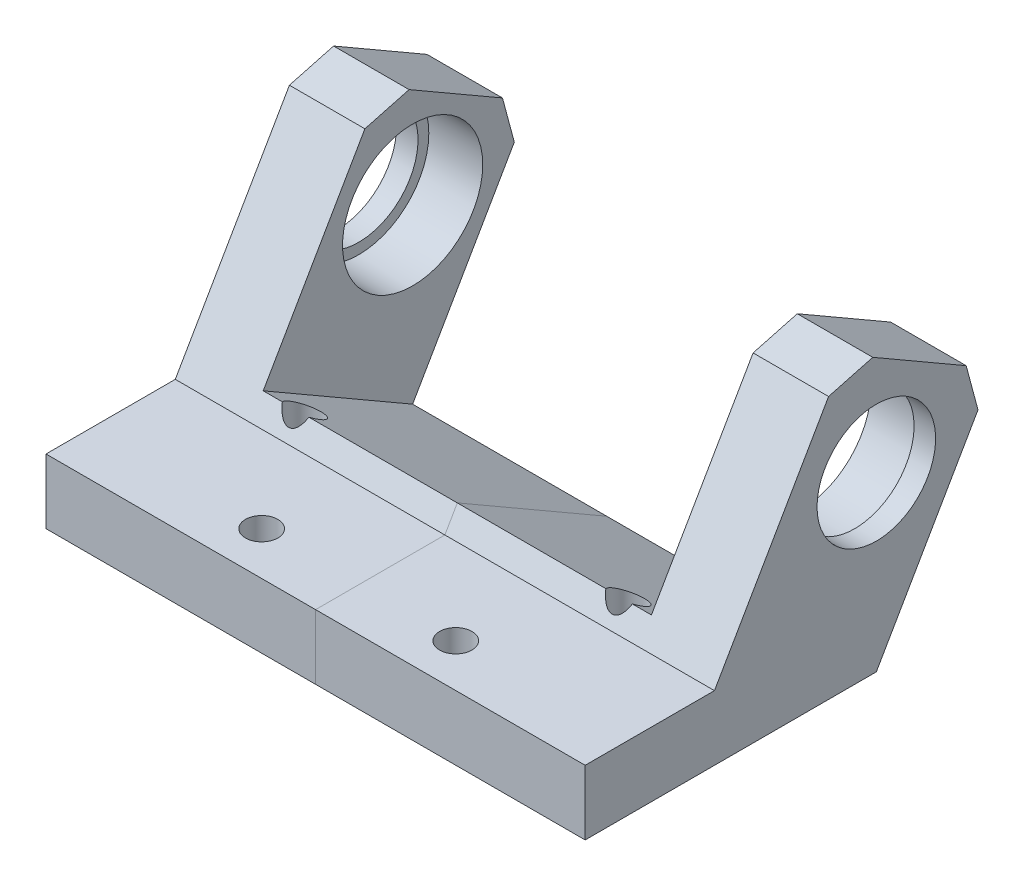
ISO-10303-21;
HEADER;
FILE_DESCRIPTION(('STEP AP214'),'2;1');
FILE_NAME('part.step','',(''),(''),'','','');
FILE_SCHEMA(('AUTOMOTIVE_DESIGN { 1 0 10303 214 1 1 1 1 }'));
ENDSEC;
DATA;
#1=APPLICATION_CONTEXT('core data for automotive mechanical design processes');
#2=APPLICATION_PROTOCOL_DEFINITION('international standard','automotive_design',2000,#1);
#3=PRODUCT_CONTEXT('',#1,'mechanical');
#4=PRODUCT('Part','Part','',(#3));
#5=PRODUCT_RELATED_PRODUCT_CATEGORY('part','',(#4));
#6=PRODUCT_DEFINITION_FORMATION('','',#4);
#7=PRODUCT_DEFINITION_CONTEXT('part definition',#1,'design');
#8=PRODUCT_DEFINITION('design','',#6,#7);
#9=PRODUCT_DEFINITION_SHAPE('','',#8);
#10=(LENGTH_UNIT() NAMED_UNIT(*) SI_UNIT(.MILLI.,.METRE.));
#11=(NAMED_UNIT(*) PLANE_ANGLE_UNIT() SI_UNIT($,.RADIAN.));
#12=(NAMED_UNIT(*) SI_UNIT($,.STERADIAN.) SOLID_ANGLE_UNIT());
#13=UNCERTAINTY_MEASURE_WITH_UNIT(LENGTH_MEASURE(1.E-05),#10,'distance_accuracy_value','');
#14=(GEOMETRIC_REPRESENTATION_CONTEXT(3) GLOBAL_UNCERTAINTY_ASSIGNED_CONTEXT((#13)) GLOBAL_UNIT_ASSIGNED_CONTEXT((#10,
#11,#12)) REPRESENTATION_CONTEXT('',''));
#15=CARTESIAN_POINT('',(0.,0.,0.));
#16=DIRECTION('',(0.,0.,1.));
#17=DIRECTION('',(1.,0.,0.));
#18=AXIS2_PLACEMENT_3D('',#15,#16,#17);
#19=CARTESIAN_POINT('',(0.,0.,0.));
#20=DIRECTION('',(1.,0.,0.));
#21=DIRECTION('',(0.,0.,1.));
#22=AXIS2_PLACEMENT_3D('',#19,#20,#21);
#23=PLANE('',#22);
#24=DIRECTION('',(0.,0.499999999999999,0.866025403784439));
#25=VECTOR('',#24,1.);
#26=CARTESIAN_POINT('',(0.,0.,0.));
#27=LINE('',#26,#25);
#28=CARTESIAN_POINT('',(0.,0.,0.));
#29=VERTEX_POINT('',#28);
#30=CARTESIAN_POINT('',(0.,7.99999999999997,13.856406460551));
#31=VERTEX_POINT('',#30);
#32=EDGE_CURVE('E152',#29,#31,#27,.T.);
#33=ORIENTED_EDGE('',*,*,#32,.T.);
#34=DIRECTION('',(0.,0.86602540378444,-0.499999999999998));
#35=VECTOR('',#34,1.);
#36=CARTESIAN_POINT('',(0.,26.9282032302755,2.92820323027557));
#37=LINE('',#36,#35);
#38=CARTESIAN_POINT('',(0.,6.,15.0111069989303));
#39=VERTEX_POINT('',#38);
#40=EDGE_CURVE('E132',#39,#31,#37,.T.);
#41=ORIENTED_EDGE('',*,*,#40,.F.);
#42=DIRECTION('',(0.,0.,-1.));
#43=VECTOR('',#42,1.);
#44=CARTESIAN_POINT('',(0.,6.,15.0111069989303));
#45=LINE('',#44,#43);
#46=CARTESIAN_POINT('',(0.,6.,27.));
#47=VERTEX_POINT('',#46);
#48=EDGE_CURVE('E142',#47,#39,#45,.T.);
#49=ORIENTED_EDGE('',*,*,#48,.F.);
#50=DIRECTION('',(0.,1.,0.));
#51=VECTOR('',#50,1.);
#52=CARTESIAN_POINT('',(0.,6.,27.));
#53=LINE('',#52,#51);
#54=CARTESIAN_POINT('',(0.,0.,27.));
#55=VERTEX_POINT('',#54);
#56=EDGE_CURVE('E148',#55,#47,#53,.T.);
#57=ORIENTED_EDGE('',*,*,#56,.F.);
#58=DIRECTION('',(0.,0.,1.));
#59=VECTOR('',#58,1.);
#60=CARTESIAN_POINT('',(0.,0.,27.));
#61=LINE('',#60,#59);
#62=EDGE_CURVE('E214',#29,#55,#61,.T.);
#63=ORIENTED_EDGE('',*,*,#62,.F.);
#64=EDGE_LOOP('',(#33,#41,#49,#57,#63));
#65=FACE_BOUND('',#64,.T.);
#66=ADVANCED_FACE('F49',(#65),#23,.T.);
#67=CARTESIAN_POINT('',(-23.,16.,0.));
#68=DIRECTION('',(-1.,0.,0.));
#69=DIRECTION('',(0.,0.,1.));
#70=AXIS2_PLACEMENT_3D('',#67,#68,#69);
#71=PLANE('',#70);
#72=CARTESIAN_POINT('',(-23.,16.,0.));
#73=DIRECTION('',(-1.,0.,0.));
#74=DIRECTION('',(0.,0.,1.));
#75=AXIS2_PLACEMENT_3D('',#72,#73,#74);
#76=CIRCLE('',#75,6.5);
#77=CARTESIAN_POINT('',(-23.,16.,6.50000000000004));
#78=VERTEX_POINT('',#77);
#79=EDGE_CURVE('E195',#78,#78,#76,.T.);
#80=ORIENTED_EDGE('',*,*,#79,.F.);
#81=EDGE_LOOP('',(#80));
#82=FACE_BOUND('',#81,.T.);
#83=CARTESIAN_POINT('',(-23.,16.,0.));
#84=DIRECTION('',(-1.,0.,0.));
#85=DIRECTION('',(0.,0.,1.));
#86=AXIS2_PLACEMENT_3D('',#83,#84,#85);
#87=CIRCLE('',#86,5.5);
#88=CARTESIAN_POINT('',(-23.,16.,5.50000000000004));
#89=VERTEX_POINT('',#88);
#90=EDGE_CURVE('E199',#89,#89,#87,.T.);
#91=ORIENTED_EDGE('',*,*,#90,.T.);
#92=EDGE_LOOP('',(#91));
#93=FACE_BOUND('',#92,.T.);
#94=ADVANCED_FACE('F274',(#82,#93),#71,.F.);
#95=CARTESIAN_POINT('',(-23.,16.,0.));
#96=DIRECTION('',(-1.,0.,0.));
#97=DIRECTION('',(0.,0.,-1.));
#98=AXIS2_PLACEMENT_3D('',#95,#96,#97);
#99=CYLINDRICAL_SURFACE('',#98,5.5);
#100=ORIENTED_EDGE('',*,*,#90,.F.);
#101=EDGE_LOOP('',(#100));
#102=FACE_BOUND('',#101,.T.);
#103=CARTESIAN_POINT('',(-25.,16.,0.));
#104=DIRECTION('',(-1.,0.,0.));
#105=DIRECTION('',(0.,0.,1.));
#106=AXIS2_PLACEMENT_3D('',#103,#104,#105);
#107=CIRCLE('',#106,5.5);
#108=CARTESIAN_POINT('',(-25.,16.,5.50000000000004));
#109=VERTEX_POINT('',#108);
#110=EDGE_CURVE('E200',#109,#109,#107,.T.);
#111=ORIENTED_EDGE('',*,*,#110,.T.);
#112=EDGE_LOOP('',(#111));
#113=FACE_BOUND('',#112,.T.);
#114=ADVANCED_FACE('F272',(#102,#113),#99,.F.);
#115=CARTESIAN_POINT('',(25.,18.9282032302755,-10.9282032302755));
#116=DIRECTION('',(0.,-0.86602540378444,0.499999999999998));
#117=DIRECTION('',(0.,0.499999999999998,0.86602540378444));
#118=AXIS2_PLACEMENT_3D('',#115,#116,#117);
#119=PLANE('',#118);
#120=DIRECTION('',(1.,0.,0.));
#121=VECTOR('',#120,1.);
#122=CARTESIAN_POINT('',(25.,20.4282032302755,-8.33012701892215));
#123=LINE('',#122,#121);
#124=CARTESIAN_POINT('',(-25.,20.4282032302755,-8.33012701892215));
#125=VERTEX_POINT('',#124);
#126=CARTESIAN_POINT('',(-18.,20.4282032302755,-8.33012701892215));
#127=VERTEX_POINT('',#126);
#128=EDGE_CURVE('E159',#125,#127,#123,.T.);
#129=ORIENTED_EDGE('',*,*,#128,.F.);
#130=DIRECTION('',(0.,-0.499999999999998,-0.86602540378444));
#131=VECTOR('',#130,1.);
#132=CARTESIAN_POINT('',(-25.,18.9282032302755,-10.9282032302755));
#133=LINE('',#132,#131);
#134=CARTESIAN_POINT('',(-25.,25.4282032302755,0.33012701892226));
#135=VERTEX_POINT('',#134);
#136=EDGE_CURVE('E231',#135,#125,#133,.T.);
#137=ORIENTED_EDGE('',*,*,#136,.F.);
#138=DIRECTION('',(-1.,0.,0.));
#139=VECTOR('',#138,1.);
#140=CARTESIAN_POINT('',(25.,25.4282032302755,0.330127018922264));
#141=LINE('',#140,#139);
#142=CARTESIAN_POINT('',(-18.,25.4282032302755,0.330127018922256));
#143=VERTEX_POINT('',#142);
#144=EDGE_CURVE('E163',#143,#135,#141,.T.);
#145=ORIENTED_EDGE('',*,*,#144,.F.);
#146=DIRECTION('',(0.,-0.499999999999999,-0.866025403784439));
#147=VECTOR('',#146,1.);
#148=CARTESIAN_POINT('',(-18.,26.9282032302755,2.92820323027556));
#149=LINE('',#148,#147);
#150=EDGE_CURVE('E193',#143,#127,#149,.T.);
#151=ORIENTED_EDGE('',*,*,#150,.T.);
#152=EDGE_LOOP('',(#129,#137,#145,#151));
#153=FACE_BOUND('',#152,.T.);
#154=ADVANCED_FACE('F257',(#153),#119,.F.);
#155=CARTESIAN_POINT('',(25.,16.3301270189222,-9.42820323027548));
#156=DIRECTION('',(0.,-0.258819045102525,0.965925826289067));
#157=DIRECTION('',(-1.,0.,0.));
#158=AXIS2_PLACEMENT_3D('',#155,#156,#157);
#159=PLANE('',#158);
#160=DIRECTION('',(0.,0.965925826289067,0.258819045102525));
#161=VECTOR('',#160,1.);
#162=CARTESIAN_POINT('',(-18.,16.3301270189222,-9.42820323027548));
#163=LINE('',#162,#161);
#164=CARTESIAN_POINT('',(-18.,16.3301270189222,-9.42820323027548));
#165=VERTEX_POINT('',#164);
#166=EDGE_CURVE('E188',#127,#165,#163,.F.);
#167=ORIENTED_EDGE('',*,*,#166,.T.);
#168=DIRECTION('',(-1.,0.,0.));
#169=VECTOR('',#168,1.);
#170=CARTESIAN_POINT('',(25.,16.3301270189222,-9.42820323027548));
#171=LINE('',#170,#169);
#172=CARTESIAN_POINT('',(-25.,16.3301270189222,-9.42820323027548));
#173=VERTEX_POINT('',#172);
#174=EDGE_CURVE('E167',#165,#173,#171,.T.);
#175=ORIENTED_EDGE('',*,*,#174,.T.);
#176=DIRECTION('',(0.,-0.965925826289067,-0.258819045102525));
#177=VECTOR('',#176,1.);
#178=CARTESIAN_POINT('',(-25.,16.3301270189222,-9.42820323027548));
#179=LINE('',#178,#177);
#180=EDGE_CURVE('E166',#173,#125,#179,.F.);
#181=ORIENTED_EDGE('',*,*,#180,.T.);
#182=ORIENTED_EDGE('',*,*,#128,.T.);
#183=EDGE_LOOP('',(#167,#175,#181,#182));
#184=FACE_BOUND('',#183,.T.);
#185=ADVANCED_FACE('F247',(#184),#159,.F.);
#186=CARTESIAN_POINT('',(25.,16.,0.));
#187=DIRECTION('',(-1.,0.,0.));
#188=DIRECTION('',(0.,0.,-1.));
#189=AXIS2_PLACEMENT_3D('',#186,#187,#188);
#190=CYLINDRICAL_SURFACE('',#189,6.5);
#191=CARTESIAN_POINT('',(-18.,16.,0.));
#192=DIRECTION('',(1.,0.,0.));
#193=DIRECTION('',(0.,0.,-1.));
#194=AXIS2_PLACEMENT_3D('',#191,#192,#193);
#195=CIRCLE('',#194,6.5);
#196=CARTESIAN_POINT('',(-18.,16.,-6.49999999999997));
#197=VERTEX_POINT('',#196);
#198=EDGE_CURVE('E241',#197,#197,#195,.T.);
#199=ORIENTED_EDGE('',*,*,#198,.T.);
#200=EDGE_LOOP('',(#199));
#201=FACE_BOUND('',#200,.T.);
#202=ORIENTED_EDGE('',*,*,#79,.T.);
#203=EDGE_LOOP('',(#202));
#204=FACE_BOUND('',#203,.T.);
#205=ADVANCED_FACE('F293',(#201,#204),#190,.F.);
#206=CARTESIAN_POINT('',(25.,0.,0.));
#207=DIRECTION('',(0.,0.499999999999998,0.86602540378444));
#208=DIRECTION('',(0.,0.86602540378444,-0.499999999999998));
#209=AXIS2_PLACEMENT_3D('',#206,#207,#208);
#210=PLANE('',#209);
#211=DIRECTION('',(-1.,0.,0.));
#212=VECTOR('',#211,1.);
#213=CARTESIAN_POINT('',(25.,0.,0.));
#214=LINE('',#213,#212);
#215=CARTESIAN_POINT('',(-18.,0.,0.));
#216=VERTEX_POINT('',#215);
#217=CARTESIAN_POINT('',(-25.,0.,0.));
#218=VERTEX_POINT('',#217);
#219=EDGE_CURVE('E138',#216,#218,#214,.T.);
#220=ORIENTED_EDGE('',*,*,#219,.T.);
#221=DIRECTION('',(0.,-0.86602540378444,0.499999999999998));
#222=VECTOR('',#221,1.);
#223=CARTESIAN_POINT('',(-25.,0.,0.));
#224=LINE('',#223,#222);
#225=EDGE_CURVE('E176',#173,#218,#224,.T.);
#226=ORIENTED_EDGE('',*,*,#225,.F.);
#227=ORIENTED_EDGE('',*,*,#174,.F.);
#228=DIRECTION('',(0.,0.86602540378444,-0.499999999999998));
#229=VECTOR('',#228,1.);
#230=CARTESIAN_POINT('',(-18.,0.,0.));
#231=LINE('',#230,#229);
#232=EDGE_CURVE('E185',#216,#165,#231,.T.);
#233=ORIENTED_EDGE('',*,*,#232,.F.);
#234=EDGE_LOOP('',(#220,#226,#227,#233));
#235=FACE_BOUND('',#234,.T.);
#236=ADVANCED_FACE('F262',(#235),#210,.F.);
#237=CARTESIAN_POINT('',(25.,6.,27.));
#238=DIRECTION('',(0.,0.,-1.));
#239=DIRECTION('',(1.,0.,0.));
#240=AXIS2_PLACEMENT_3D('',#237,#238,#239);
#241=PLANE('',#240);
#242=ORIENTED_EDGE('',*,*,#56,.T.);
#243=DIRECTION('',(-1.,0.,0.));
#244=VECTOR('',#243,1.);
#245=CARTESIAN_POINT('',(25.,6.,27.));
#246=LINE('',#245,#244);
#247=CARTESIAN_POINT('',(-25.,6.,27.));
#248=VERTEX_POINT('',#247);
#249=EDGE_CURVE('E139',#47,#248,#246,.T.);
#250=ORIENTED_EDGE('',*,*,#249,.T.);
#251=DIRECTION('',(0.,1.,0.));
#252=VECTOR('',#251,1.);
#253=CARTESIAN_POINT('',(-25.,6.,27.));
#254=LINE('',#253,#252);
#255=CARTESIAN_POINT('',(-25.,0.,27.));
#256=VERTEX_POINT('',#255);
#257=EDGE_CURVE('E237',#256,#248,#254,.T.);
#258=ORIENTED_EDGE('',*,*,#257,.F.);
#259=DIRECTION('',(-1.,0.,0.));
#260=VECTOR('',#259,1.);
#261=CARTESIAN_POINT('',(25.,0.,27.));
#262=LINE('',#261,#260);
#263=EDGE_CURVE('E170',#55,#256,#262,.T.);
#264=ORIENTED_EDGE('',*,*,#263,.F.);
#265=EDGE_LOOP('',(#242,#250,#258,#264));
#266=FACE_BOUND('',#265,.T.);
#267=ADVANCED_FACE('F216',(#266),#241,.F.);
#268=CARTESIAN_POINT('',(-9.,0.,23.));
#269=DIRECTION('',(0.,-1.,0.));
#270=DIRECTION('',(0.,0.,1.));
#271=AXIS2_PLACEMENT_3D('',#268,#269,#270);
#272=CYLINDRICAL_SURFACE('',#271,1.49999999999999);
#273=CARTESIAN_POINT('',(-9.,0.,23.));
#274=DIRECTION('',(0.,1.,0.));
#275=DIRECTION('',(0.,0.,1.));
#276=AXIS2_PLACEMENT_3D('',#273,#274,#275);
#277=CIRCLE('',#276,1.49999999999999);
#278=CARTESIAN_POINT('',(-9.,0.,24.5));
#279=VERTEX_POINT('',#278);
#280=EDGE_CURVE('E12',#279,#279,#277,.T.);
#281=ORIENTED_EDGE('',*,*,#280,.F.);
#282=EDGE_LOOP('',(#281));
#283=FACE_BOUND('',#282,.T.);
#284=CARTESIAN_POINT('',(-9.,6.,23.));
#285=DIRECTION('',(0.,1.,0.));
#286=DIRECTION('',(0.,0.,1.));
#287=AXIS2_PLACEMENT_3D('',#284,#285,#286);
#288=CIRCLE('',#287,1.49999999999999);
#289=CARTESIAN_POINT('',(-9.,6.,24.5));
#290=VERTEX_POINT('',#289);
#291=EDGE_CURVE('E58',#290,#290,#288,.T.);
#292=ORIENTED_EDGE('',*,*,#291,.T.);
#293=EDGE_LOOP('',(#292));
#294=FACE_BOUND('',#293,.T.);
#295=ADVANCED_FACE('F292',(#283,#294),#272,.F.);
#296=CARTESIAN_POINT('',(25.,25.4282032302755,0.330127018922264));
#297=DIRECTION('',(0.,-0.965925826289067,-0.258819045102525));
#298=DIRECTION('',(-1.,0.,0.));
#299=AXIS2_PLACEMENT_3D('',#296,#297,#298);
#300=PLANE('',#299);
#301=DIRECTION('',(0.,-0.258819045102525,0.965925826289067));
#302=VECTOR('',#301,1.);
#303=CARTESIAN_POINT('',(-18.,25.4282032302755,0.330127018922264));
#304=LINE('',#303,#302);
#305=CARTESIAN_POINT('',(-18.,24.3301270189222,4.42820323027556));
#306=VERTEX_POINT('',#305);
#307=EDGE_CURVE('E160',#306,#143,#304,.F.);
#308=ORIENTED_EDGE('',*,*,#307,.T.);
#309=ORIENTED_EDGE('',*,*,#144,.T.);
#310=DIRECTION('',(0.,0.258819045102525,-0.965925826289067));
#311=VECTOR('',#310,1.);
#312=CARTESIAN_POINT('',(-25.,25.4282032302755,0.330127018922264));
#313=LINE('',#312,#311);
#314=CARTESIAN_POINT('',(-25.,24.3301270189222,4.42820323027556));
#315=VERTEX_POINT('',#314);
#316=EDGE_CURVE('E171',#135,#315,#313,.F.);
#317=ORIENTED_EDGE('',*,*,#316,.T.);
#318=DIRECTION('',(1.,0.,0.));
#319=VECTOR('',#318,1.);
#320=CARTESIAN_POINT('',(25.,24.3301270189222,4.42820323027556));
#321=LINE('',#320,#319);
#322=EDGE_CURVE('E156',#315,#306,#321,.T.);
#323=ORIENTED_EDGE('',*,*,#322,.T.);
#324=EDGE_LOOP('',(#308,#309,#317,#323));
#325=FACE_BOUND('',#324,.T.);
#326=ADVANCED_FACE('F260',(#325),#300,.F.);
#327=CARTESIAN_POINT('',(-25.,0.,0.));
#328=DIRECTION('',(1.,0.,0.));
#329=DIRECTION('',(0.,0.,1.));
#330=AXIS2_PLACEMENT_3D('',#327,#328,#329);
#331=PLANE('',#330);
#332=ORIENTED_EDGE('',*,*,#225,.T.);
#333=DIRECTION('',(0.,0.,1.));
#334=VECTOR('',#333,1.);
#335=CARTESIAN_POINT('',(-25.,0.,27.));
#336=LINE('',#335,#334);
#337=EDGE_CURVE('E240',#218,#256,#336,.T.);
#338=ORIENTED_EDGE('',*,*,#337,.T.);
#339=ORIENTED_EDGE('',*,*,#257,.T.);
#340=DIRECTION('',(0.,0.,-1.));
#341=VECTOR('',#340,1.);
#342=CARTESIAN_POINT('',(-25.,6.,15.0111069989303));
#343=LINE('',#342,#341);
#344=CARTESIAN_POINT('',(-25.,6.,15.0111069989303));
#345=VERTEX_POINT('',#344);
#346=EDGE_CURVE('E235',#248,#345,#343,.T.);
#347=ORIENTED_EDGE('',*,*,#346,.T.);
#348=DIRECTION('',(0.,0.86602540378444,-0.499999999999998));
#349=VECTOR('',#348,1.);
#350=CARTESIAN_POINT('',(-25.,26.9282032302755,2.92820323027557));
#351=LINE('',#350,#349);
#352=EDGE_CURVE('E135',#345,#315,#351,.T.);
#353=ORIENTED_EDGE('',*,*,#352,.T.);
#354=ORIENTED_EDGE('',*,*,#316,.F.);
#355=ORIENTED_EDGE('',*,*,#136,.T.);
#356=ORIENTED_EDGE('',*,*,#180,.F.);
#357=EDGE_LOOP('',(#332,#338,#339,#347,#353,#354,#355,#356));
#358=FACE_BOUND('',#357,.T.);
#359=ORIENTED_EDGE('',*,*,#110,.F.);
#360=EDGE_LOOP('',(#359));
#361=FACE_BOUND('',#360,.T.);
#362=ADVANCED_FACE('F266',(#358,#361),#331,.F.);
#363=CARTESIAN_POINT('',(25.,6.,15.0111069989303));
#364=DIRECTION('',(0.,-1.,0.));
#365=DIRECTION('',(0.,0.,1.));
#366=AXIS2_PLACEMENT_3D('',#363,#364,#365);
#367=PLANE('',#366);
#368=ORIENTED_EDGE('',*,*,#291,.F.);
#369=EDGE_LOOP('',(#368));
#370=FACE_BOUND('',#369,.T.);
#371=ORIENTED_EDGE('',*,*,#48,.T.);
#372=DIRECTION('',(-1.,0.,0.));
#373=VECTOR('',#372,1.);
#374=CARTESIAN_POINT('',(25.,6.,15.0111069989303));
#375=LINE('',#374,#373);
#376=EDGE_CURVE('E128',#39,#345,#375,.T.);
#377=ORIENTED_EDGE('',*,*,#376,.T.);
#378=ORIENTED_EDGE('',*,*,#346,.F.);
#379=ORIENTED_EDGE('',*,*,#249,.F.);
#380=EDGE_LOOP('',(#371,#377,#378,#379));
#381=FACE_BOUND('',#380,.T.);
#382=ADVANCED_FACE('F143',(#370,#381),#367,.F.);
#383=CARTESIAN_POINT('',(-18.,7.99999999999997,13.856406460551));
#384=DIRECTION('',(-1.,0.,0.));
#385=DIRECTION('',(0.,0.,-1.));
#386=AXIS2_PLACEMENT_3D('',#383,#384,#385);
#387=PLANE('',#386);
#388=ORIENTED_EDGE('',*,*,#198,.F.);
#389=EDGE_LOOP('',(#388));
#390=FACE_BOUND('',#389,.T.);
#391=ORIENTED_EDGE('',*,*,#166,.F.);
#392=ORIENTED_EDGE('',*,*,#150,.F.);
#393=ORIENTED_EDGE('',*,*,#307,.F.);
#394=DIRECTION('',(0.,0.86602540378444,-0.499999999999998));
#395=VECTOR('',#394,1.);
#396=CARTESIAN_POINT('',(-18.,7.99999999999997,13.856406460551));
#397=LINE('',#396,#395);
#398=CARTESIAN_POINT('',(-18.,7.99999999999997,13.856406460551));
#399=VERTEX_POINT('',#398);
#400=EDGE_CURVE('E179',#399,#306,#397,.T.);
#401=ORIENTED_EDGE('',*,*,#400,.F.);
#402=DIRECTION('',(0.,-0.499999999999999,-0.866025403784439));
#403=VECTOR('',#402,1.);
#404=CARTESIAN_POINT('',(-18.,7.99999999999997,13.856406460551));
#405=LINE('',#404,#403);
#406=EDGE_CURVE('E178',#399,#216,#405,.T.);
#407=ORIENTED_EDGE('',*,*,#406,.T.);
#408=ORIENTED_EDGE('',*,*,#232,.T.);
#409=EDGE_LOOP('',(#391,#392,#393,#401,#407,#408));
#410=FACE_BOUND('',#409,.T.);
#411=ADVANCED_FACE('F252',(#390,#410),#387,.F.);
#412=CARTESIAN_POINT('',(-15.,0.,13.));
#413=DIRECTION('',(0.,-1.,0.));
#414=DIRECTION('',(0.,0.,1.));
#415=AXIS2_PLACEMENT_3D('',#412,#413,#414);
#416=CYLINDRICAL_SURFACE('',#415,1.49999999999999);
#417=CARTESIAN_POINT('',(-15.,7.50555349946509,13.));
#418=DIRECTION('',(0.,-0.866025403784439,0.499999999999999));
#419=DIRECTION('',(0.,-0.499999999999999,-0.866025403784439));
#420=AXIS2_PLACEMENT_3D('',#417,#418,#419);
#421=ELLIPSE('',#420,1.73205080756886,1.49999999999999);
#422=CARTESIAN_POINT('',(-16.2314901438202,7.99999999999997,13.856406460551));
#423=VERTEX_POINT('',#422);
#424=CARTESIAN_POINT('',(-13.7685098561798,7.99999999999997,13.856406460551));
#425=VERTEX_POINT('',#424);
#426=EDGE_CURVE('E203',#423,#425,#421,.T.);
#427=ORIENTED_EDGE('',*,*,#426,.F.);
#428=CARTESIAN_POINT('',(-15.,9.48333950160461,13.));
#429=DIRECTION('',(0.,0.499999999999998,0.86602540378444));
#430=DIRECTION('',(0.,-0.86602540378444,0.499999999999998));
#431=AXIS2_PLACEMENT_3D('',#428,#429,#430);
#432=ELLIPSE('',#431,2.99999999999999,1.49999999999999);
#433=EDGE_CURVE('E213',#423,#425,#432,.T.);
#434=ORIENTED_EDGE('',*,*,#433,.T.);
#435=EDGE_LOOP('',(#427,#434));
#436=FACE_BOUND('',#435,.T.);
#437=CARTESIAN_POINT('',(-15.,0.,13.));
#438=DIRECTION('',(0.,1.,0.));
#439=DIRECTION('',(0.,0.,1.));
#440=AXIS2_PLACEMENT_3D('',#437,#438,#439);
#441=CIRCLE('',#440,1.49999999999999);
#442=CARTESIAN_POINT('',(-15.,0.,14.5));
#443=VERTEX_POINT('',#442);
#444=EDGE_CURVE('E207',#443,#443,#441,.T.);
#445=ORIENTED_EDGE('',*,*,#444,.F.);
#446=EDGE_LOOP('',(#445));
#447=FACE_BOUND('',#446,.T.);
#448=ADVANCED_FACE('F221',(#436,#447),#416,.F.);
#449=CARTESIAN_POINT('',(25.,26.9282032302755,2.92820323027557));
#450=DIRECTION('',(0.,-0.499999999999998,-0.86602540378444));
#451=DIRECTION('',(0.,-0.86602540378444,0.499999999999998));
#452=AXIS2_PLACEMENT_3D('',#449,#450,#451);
#453=PLANE('',#452);
#454=ORIENTED_EDGE('',*,*,#40,.T.);
#455=DIRECTION('',(-1.,0.,0.));
#456=VECTOR('',#455,1.);
#457=CARTESIAN_POINT('',(-18.,7.99999999999997,13.856406460551));
#458=LINE('',#457,#456);
#459=EDGE_CURVE('E53',#31,#425,#458,.T.);
#460=ORIENTED_EDGE('',*,*,#459,.T.);
#461=ORIENTED_EDGE('',*,*,#433,.F.);
#462=EDGE_CURVE('E66',#423,#399,#458,.T.);
#463=ORIENTED_EDGE('',*,*,#462,.T.);
#464=ORIENTED_EDGE('',*,*,#400,.T.);
#465=ORIENTED_EDGE('',*,*,#322,.F.);
#466=ORIENTED_EDGE('',*,*,#352,.F.);
#467=ORIENTED_EDGE('',*,*,#376,.F.);
#468=EDGE_LOOP('',(#454,#460,#461,#463,#464,#465,#466,#467));
#469=FACE_BOUND('',#468,.T.);
#470=ADVANCED_FACE('F130',(#469),#453,.F.);
#471=CARTESIAN_POINT('',(25.,0.,27.));
#472=DIRECTION('',(0.,1.,0.));
#473=DIRECTION('',(0.,0.,-1.));
#474=AXIS2_PLACEMENT_3D('',#471,#472,#473);
#475=PLANE('',#474);
#476=ORIENTED_EDGE('',*,*,#444,.T.);
#477=EDGE_LOOP('',(#476));
#478=FACE_BOUND('',#477,.T.);
#479=ORIENTED_EDGE('',*,*,#280,.T.);
#480=EDGE_LOOP('',(#479));
#481=FACE_BOUND('',#480,.T.);
#482=ORIENTED_EDGE('',*,*,#62,.T.);
#483=ORIENTED_EDGE('',*,*,#263,.T.);
#484=ORIENTED_EDGE('',*,*,#337,.F.);
#485=ORIENTED_EDGE('',*,*,#219,.F.);
#486=DIRECTION('',(1.,0.,0.));
#487=VECTOR('',#486,1.);
#488=CARTESIAN_POINT('',(-18.,0.,0.));
#489=LINE('',#488,#487);
#490=EDGE_CURVE('E177',#216,#29,#489,.T.);
#491=ORIENTED_EDGE('',*,*,#490,.T.);
#492=EDGE_LOOP('',(#482,#483,#484,#485,#491));
#493=FACE_BOUND('',#492,.T.);
#494=ADVANCED_FACE('F263',(#478,#481,#493),#475,.F.);
#495=CARTESIAN_POINT('',(0.,0.,0.));
#496=DIRECTION('',(0.,0.866025403784439,-0.499999999999999));
#497=DIRECTION('',(0.,-0.499999999999999,-0.866025403784439));
#498=AXIS2_PLACEMENT_3D('',#495,#496,#497);
#499=PLANE('',#498);
#500=ORIENTED_EDGE('',*,*,#490,.F.);
#501=ORIENTED_EDGE('',*,*,#406,.F.);
#502=ORIENTED_EDGE('',*,*,#462,.F.);
#503=ORIENTED_EDGE('',*,*,#426,.T.);
#504=ORIENTED_EDGE('',*,*,#459,.F.);
#505=ORIENTED_EDGE('',*,*,#32,.F.);
#506=EDGE_LOOP('',(#500,#501,#502,#503,#504,#505));
#507=FACE_BOUND('',#506,.T.);
#508=ADVANCED_FACE('F51',(#507),#499,.T.);
#509=CLOSED_SHELL('',(#66,#94,#114,#154,#185,#205,#236,#267,#295,#326,#362,#382,#411,#448,#470,
#494,#508));
#510=MANIFOLD_SOLID_BREP('B2',#509);
#511=CARTESIAN_POINT('',(0.,0.,0.));
#512=DIRECTION('',(1.,0.,0.));
#513=DIRECTION('',(0.,0.,1.));
#514=AXIS2_PLACEMENT_3D('',#511,#512,#513);
#515=PLANE('',#514);
#516=DIRECTION('',(0.,0.499999999999999,0.866025403784439));
#517=VECTOR('',#516,1.);
#518=CARTESIAN_POINT('',(0.,0.,0.));
#519=LINE('',#518,#517);
#520=CARTESIAN_POINT('',(0.,0.,0.));
#521=VERTEX_POINT('',#520);
#522=CARTESIAN_POINT('',(0.,7.99999999999997,13.856406460551));
#523=VERTEX_POINT('',#522);
#524=EDGE_CURVE('E47',#521,#523,#519,.T.);
#525=ORIENTED_EDGE('',*,*,#524,.F.);
#526=DIRECTION('',(0.,0.,1.));
#527=VECTOR('',#526,1.);
#528=CARTESIAN_POINT('',(0.,0.,27.));
#529=LINE('',#528,#527);
#530=CARTESIAN_POINT('',(0.,0.,27.));
#531=VERTEX_POINT('',#530);
#532=EDGE_CURVE('E446',#521,#531,#529,.T.);
#533=ORIENTED_EDGE('',*,*,#532,.T.);
#534=DIRECTION('',(0.,1.,0.));
#535=VECTOR('',#534,1.);
#536=CARTESIAN_POINT('',(0.,6.,27.));
#537=LINE('',#536,#535);
#538=CARTESIAN_POINT('',(0.,6.,27.));
#539=VERTEX_POINT('',#538);
#540=EDGE_CURVE('E551',#531,#539,#537,.T.);
#541=ORIENTED_EDGE('',*,*,#540,.T.);
#542=DIRECTION('',(0.,0.,-1.));
#543=VECTOR('',#542,1.);
#544=CARTESIAN_POINT('',(0.,6.,15.0111069989303));
#545=LINE('',#544,#543);
#546=CARTESIAN_POINT('',(0.,6.,15.0111069989303));
#547=VERTEX_POINT('',#546);
#548=EDGE_CURVE('E543',#539,#547,#545,.T.);
#549=ORIENTED_EDGE('',*,*,#548,.T.);
#550=DIRECTION('',(0.,0.86602540378444,-0.499999999999998));
#551=VECTOR('',#550,1.);
#552=CARTESIAN_POINT('',(0.,26.9282032302755,2.92820323027557));
#553=LINE('',#552,#551);
#554=EDGE_CURVE('E540',#547,#523,#553,.T.);
#555=ORIENTED_EDGE('',*,*,#554,.T.);
#556=EDGE_LOOP('',(#525,#533,#541,#549,#555));
#557=FACE_BOUND('',#556,.T.);
#558=ADVANCED_FACE('F443',(#557),#515,.F.);
#559=CARTESIAN_POINT('',(25.,16.,0.));
#560=DIRECTION('',(-1.,0.,0.));
#561=DIRECTION('',(0.,0.,-1.));
#562=AXIS2_PLACEMENT_3D('',#559,#560,#561);
#563=CYLINDRICAL_SURFACE('',#562,6.5);
#564=CARTESIAN_POINT('',(18.,16.,0.));
#565=DIRECTION('',(-1.,0.,0.));
#566=DIRECTION('',(0.,0.,1.));
#567=AXIS2_PLACEMENT_3D('',#564,#565,#566);
#568=CIRCLE('',#567,6.5);
#569=CARTESIAN_POINT('',(18.,16.,6.50000000000004));
#570=VERTEX_POINT('',#569);
#571=EDGE_CURVE('E626',#570,#570,#568,.T.);
#572=ORIENTED_EDGE('',*,*,#571,.T.);
#573=EDGE_LOOP('',(#572));
#574=FACE_BOUND('',#573,.T.);
#575=CARTESIAN_POINT('',(23.,16.,0.));
#576=DIRECTION('',(-1.,0.,0.));
#577=DIRECTION('',(0.,0.,1.));
#578=AXIS2_PLACEMENT_3D('',#575,#576,#577);
#579=CIRCLE('',#578,6.5);
#580=CARTESIAN_POINT('',(23.,16.,6.50000000000004));
#581=VERTEX_POINT('',#580);
#582=EDGE_CURVE('E650',#581,#581,#579,.T.);
#583=ORIENTED_EDGE('',*,*,#582,.F.);
#584=EDGE_LOOP('',(#583));
#585=FACE_BOUND('',#584,.T.);
#586=ADVANCED_FACE('F631',(#574,#585),#563,.F.);
#587=CARTESIAN_POINT('',(25.,18.9282032302755,-10.9282032302755));
#588=DIRECTION('',(0.,-0.86602540378444,0.499999999999998));
#589=DIRECTION('',(0.,0.499999999999998,0.86602540378444));
#590=AXIS2_PLACEMENT_3D('',#587,#588,#589);
#591=PLANE('',#590);
#592=DIRECTION('',(-1.,0.,0.));
#593=VECTOR('',#592,1.);
#594=CARTESIAN_POINT('',(25.,25.4282032302755,0.330127018922264));
#595=LINE('',#594,#593);
#596=CARTESIAN_POINT('',(25.,25.4282032302755,0.330127018922254));
#597=VERTEX_POINT('',#596);
#598=CARTESIAN_POINT('',(18.,25.4282032302755,0.330127018922256));
#599=VERTEX_POINT('',#598);
#600=EDGE_CURVE('E605',#597,#599,#595,.T.);
#601=ORIENTED_EDGE('',*,*,#600,.F.);
#602=DIRECTION('',(0.,-0.499999999999998,-0.86602540378444));
#603=VECTOR('',#602,1.);
#604=CARTESIAN_POINT('',(25.,18.9282032302755,-10.9282032302755));
#605=LINE('',#604,#603);
#606=CARTESIAN_POINT('',(25.,20.4282032302755,-8.33012701892215));
#607=VERTEX_POINT('',#606);
#608=EDGE_CURVE('E592',#597,#607,#605,.T.);
#609=ORIENTED_EDGE('',*,*,#608,.T.);
#610=DIRECTION('',(1.,0.,0.));
#611=VECTOR('',#610,1.);
#612=CARTESIAN_POINT('',(25.,20.4282032302755,-8.33012701892215));
#613=LINE('',#612,#611);
#614=CARTESIAN_POINT('',(18.,20.4282032302755,-8.33012701892215));
#615=VERTEX_POINT('',#614);
#616=EDGE_CURVE('E608',#615,#607,#613,.T.);
#617=ORIENTED_EDGE('',*,*,#616,.F.);
#618=DIRECTION('',(0.,0.499999999999999,0.866025403784439));
#619=VECTOR('',#618,1.);
#620=CARTESIAN_POINT('',(18.,26.9282032302755,2.92820323027556));
#621=LINE('',#620,#619);
#622=EDGE_CURVE('E639',#615,#599,#621,.T.);
#623=ORIENTED_EDGE('',*,*,#622,.T.);
#624=EDGE_LOOP('',(#601,#609,#617,#623));
#625=FACE_BOUND('',#624,.T.);
#626=ADVANCED_FACE('F649',(#625),#591,.F.);
#627=CARTESIAN_POINT('',(25.,0.,0.));
#628=DIRECTION('',(0.,0.499999999999998,0.86602540378444));
#629=DIRECTION('',(0.,0.86602540378444,-0.499999999999998));
#630=AXIS2_PLACEMENT_3D('',#627,#628,#629);
#631=PLANE('',#630);
#632=DIRECTION('',(-1.,0.,0.));
#633=VECTOR('',#632,1.);
#634=CARTESIAN_POINT('',(25.,16.3301270189222,-9.42820323027548));
#635=LINE('',#634,#633);
#636=CARTESIAN_POINT('',(25.,16.3301270189222,-9.42820323027548));
#637=VERTEX_POINT('',#636);
#638=CARTESIAN_POINT('',(18.,16.3301270189222,-9.42820323027548));
#639=VERTEX_POINT('',#638);
#640=EDGE_CURVE('E566',#637,#639,#635,.T.);
#641=ORIENTED_EDGE('',*,*,#640,.F.);
#642=DIRECTION('',(0.,-0.86602540378444,0.499999999999998));
#643=VECTOR('',#642,1.);
#644=CARTESIAN_POINT('',(25.,0.,0.));
#645=LINE('',#644,#643);
#646=CARTESIAN_POINT('',(25.,0.,0.));
#647=VERTEX_POINT('',#646);
#648=EDGE_CURVE('E595',#637,#647,#645,.T.);
#649=ORIENTED_EDGE('',*,*,#648,.T.);
#650=DIRECTION('',(-1.,0.,0.));
#651=VECTOR('',#650,1.);
#652=CARTESIAN_POINT('',(25.,0.,0.));
#653=LINE('',#652,#651);
#654=CARTESIAN_POINT('',(18.,0.,0.));
#655=VERTEX_POINT('',#654);
#656=EDGE_CURVE('E582',#647,#655,#653,.T.);
#657=ORIENTED_EDGE('',*,*,#656,.T.);
#658=DIRECTION('',(0.,0.86602540378444,-0.499999999999998));
#659=VECTOR('',#658,1.);
#660=CARTESIAN_POINT('',(18.,0.,0.));
#661=LINE('',#660,#659);
#662=EDGE_CURVE('E617',#655,#639,#661,.T.);
#663=ORIENTED_EDGE('',*,*,#662,.T.);
#664=EDGE_LOOP('',(#641,#649,#657,#663));
#665=FACE_BOUND('',#664,.T.);
#666=ADVANCED_FACE('F644',(#665),#631,.F.);
#667=CARTESIAN_POINT('',(25.,16.3301270189222,-9.42820323027548));
#668=DIRECTION('',(0.,-0.258819045102525,0.965925826289067));
#669=DIRECTION('',(-1.,0.,0.));
#670=AXIS2_PLACEMENT_3D('',#667,#668,#669);
#671=PLANE('',#670);
#672=DIRECTION('',(0.,-0.965925826289067,-0.258819045102525));
#673=VECTOR('',#672,1.);
#674=CARTESIAN_POINT('',(18.,16.3301270189222,-9.42820323027548));
#675=LINE('',#674,#673);
#676=EDGE_CURVE('E620',#639,#615,#675,.F.);
#677=ORIENTED_EDGE('',*,*,#676,.T.);
#678=ORIENTED_EDGE('',*,*,#616,.T.);
#679=DIRECTION('',(0.,0.965925826289067,0.258819045102525));
#680=VECTOR('',#679,1.);
#681=CARTESIAN_POINT('',(25.,3.45096189432341,-12.8791651245989));
#682=LINE('',#681,#680);
#683=EDGE_CURVE('E612',#607,#637,#682,.F.);
#684=ORIENTED_EDGE('',*,*,#683,.T.);
#685=ORIENTED_EDGE('',*,*,#640,.T.);
#686=EDGE_LOOP('',(#677,#678,#684,#685));
#687=FACE_BOUND('',#686,.T.);
#688=ADVANCED_FACE('F645',(#687),#671,.F.);
#689=CARTESIAN_POINT('',(25.,25.4282032302755,0.330127018922264));
#690=DIRECTION('',(0.,-0.965925826289067,-0.258819045102525));
#691=DIRECTION('',(-1.,0.,0.));
#692=AXIS2_PLACEMENT_3D('',#689,#690,#691);
#693=PLANE('',#692);
#694=DIRECTION('',(0.,0.258819045102525,-0.965925826289067));
#695=VECTOR('',#694,1.);
#696=CARTESIAN_POINT('',(18.,25.4282032302755,0.330127018922264));
#697=LINE('',#696,#695);
#698=CARTESIAN_POINT('',(18.,24.3301270189222,4.42820323027556));
#699=VERTEX_POINT('',#698);
#700=EDGE_CURVE('E541',#599,#699,#697,.F.);
#701=ORIENTED_EDGE('',*,*,#700,.T.);
#702=DIRECTION('',(1.,0.,0.));
#703=VECTOR('',#702,1.);
#704=CARTESIAN_POINT('',(25.,24.3301270189222,4.42820323027556));
#705=LINE('',#704,#703);
#706=CARTESIAN_POINT('',(25.,24.3301270189222,4.42820323027556));
#707=VERTEX_POINT('',#706);
#708=EDGE_CURVE('E546',#699,#707,#705,.T.);
#709=ORIENTED_EDGE('',*,*,#708,.T.);
#710=DIRECTION('',(0.,-0.258819045102525,0.965925826289067));
#711=VECTOR('',#710,1.);
#712=CARTESIAN_POINT('',(25.,23.8073683548743,6.37916512459895));
#713=LINE('',#712,#711);
#714=EDGE_CURVE('E590',#707,#597,#713,.F.);
#715=ORIENTED_EDGE('',*,*,#714,.T.);
#716=ORIENTED_EDGE('',*,*,#600,.T.);
#717=EDGE_LOOP('',(#701,#709,#715,#716));
#718=FACE_BOUND('',#717,.T.);
#719=ADVANCED_FACE('F614',(#718),#693,.F.);
#720=CARTESIAN_POINT('',(25.,0.,0.));
#721=DIRECTION('',(1.,0.,0.));
#722=DIRECTION('',(0.,0.,1.));
#723=AXIS2_PLACEMENT_3D('',#720,#721,#722);
#724=PLANE('',#723);
#725=ORIENTED_EDGE('',*,*,#608,.F.);
#726=ORIENTED_EDGE('',*,*,#714,.F.);
#727=DIRECTION('',(0.,0.86602540378444,-0.499999999999998));
#728=VECTOR('',#727,1.);
#729=CARTESIAN_POINT('',(25.,26.9282032302755,2.92820323027557));
#730=LINE('',#729,#728);
#731=CARTESIAN_POINT('',(25.,6.,15.0111069989303));
#732=VERTEX_POINT('',#731);
#733=EDGE_CURVE('E580',#732,#707,#730,.T.);
#734=ORIENTED_EDGE('',*,*,#733,.F.);
#735=DIRECTION('',(0.,0.,-1.));
#736=VECTOR('',#735,1.);
#737=CARTESIAN_POINT('',(25.,6.,15.0111069989303));
#738=LINE('',#737,#736);
#739=CARTESIAN_POINT('',(25.,6.,27.));
#740=VERTEX_POINT('',#739);
#741=EDGE_CURVE('E584',#740,#732,#738,.T.);
#742=ORIENTED_EDGE('',*,*,#741,.F.);
#743=DIRECTION('',(0.,1.,0.));
#744=VECTOR('',#743,1.);
#745=CARTESIAN_POINT('',(25.,6.,27.));
#746=LINE('',#745,#744);
#747=CARTESIAN_POINT('',(25.,0.,27.));
#748=VERTEX_POINT('',#747);
#749=EDGE_CURVE('E571',#748,#740,#746,.T.);
#750=ORIENTED_EDGE('',*,*,#749,.F.);
#751=DIRECTION('',(0.,0.,1.));
#752=VECTOR('',#751,1.);
#753=CARTESIAN_POINT('',(25.,0.,27.));
#754=LINE('',#753,#752);
#755=EDGE_CURVE('E562',#647,#748,#754,.T.);
#756=ORIENTED_EDGE('',*,*,#755,.F.);
#757=ORIENTED_EDGE('',*,*,#648,.F.);
#758=ORIENTED_EDGE('',*,*,#683,.F.);
#759=EDGE_LOOP('',(#725,#726,#734,#742,#750,#756,#757,#758));
#760=FACE_BOUND('',#759,.T.);
#761=CARTESIAN_POINT('',(25.,16.,0.));
#762=DIRECTION('',(-1.,0.,0.));
#763=DIRECTION('',(0.,0.,1.));
#764=AXIS2_PLACEMENT_3D('',#761,#762,#763);
#765=CIRCLE('',#764,5.5);
#766=CARTESIAN_POINT('',(25.,16.,5.50000000000004));
#767=VERTEX_POINT('',#766);
#768=EDGE_CURVE('E656',#767,#767,#765,.T.);
#769=ORIENTED_EDGE('',*,*,#768,.T.);
#770=EDGE_LOOP('',(#769));
#771=FACE_BOUND('',#770,.T.);
#772=ADVANCED_FACE('F588',(#760,#771),#724,.T.);
#773=CARTESIAN_POINT('',(25.,0.,27.));
#774=DIRECTION('',(0.,1.,0.));
#775=DIRECTION('',(0.,0.,-1.));
#776=AXIS2_PLACEMENT_3D('',#773,#774,#775);
#777=PLANE('',#776);
#778=CARTESIAN_POINT('',(15.,0.,13.));
#779=DIRECTION('',(0.,1.,0.));
#780=DIRECTION('',(0.,0.,1.));
#781=AXIS2_PLACEMENT_3D('',#778,#779,#780);
#782=CIRCLE('',#781,1.49999999999999);
#783=CARTESIAN_POINT('',(15.,0.,14.5));
#784=VERTEX_POINT('',#783);
#785=EDGE_CURVE('E531',#784,#784,#782,.T.);
#786=ORIENTED_EDGE('',*,*,#785,.T.);
#787=EDGE_LOOP('',(#786));
#788=FACE_BOUND('',#787,.T.);
#789=CARTESIAN_POINT('',(9.,0.,23.));
#790=DIRECTION('',(0.,1.,0.));
#791=DIRECTION('',(0.,0.,1.));
#792=AXIS2_PLACEMENT_3D('',#789,#790,#791);
#793=CIRCLE('',#792,1.49999999999999);
#794=CARTESIAN_POINT('',(9.,0.,24.5));
#795=VERTEX_POINT('',#794);
#796=EDGE_CURVE('E530',#795,#795,#793,.T.);
#797=ORIENTED_EDGE('',*,*,#796,.T.);
#798=EDGE_LOOP('',(#797));
#799=FACE_BOUND('',#798,.T.);
#800=DIRECTION('',(1.,0.,0.));
#801=VECTOR('',#800,1.);
#802=CARTESIAN_POINT('',(-18.,0.,0.));
#803=LINE('',#802,#801);
#804=EDGE_CURVE('E465',#521,#655,#803,.T.);
#805=ORIENTED_EDGE('',*,*,#804,.T.);
#806=ORIENTED_EDGE('',*,*,#656,.F.);
#807=ORIENTED_EDGE('',*,*,#755,.T.);
#808=DIRECTION('',(-1.,0.,0.));
#809=VECTOR('',#808,1.);
#810=CARTESIAN_POINT('',(25.,0.,27.));
#811=LINE('',#810,#809);
#812=EDGE_CURVE('E561',#748,#531,#811,.T.);
#813=ORIENTED_EDGE('',*,*,#812,.T.);
#814=ORIENTED_EDGE('',*,*,#532,.F.);
#815=EDGE_LOOP('',(#805,#806,#807,#813,#814));
#816=FACE_BOUND('',#815,.T.);
#817=ADVANCED_FACE('F557',(#788,#799,#816),#777,.F.);
#818=CARTESIAN_POINT('',(25.,6.,27.));
#819=DIRECTION('',(0.,0.,-1.));
#820=DIRECTION('',(1.,0.,0.));
#821=AXIS2_PLACEMENT_3D('',#818,#819,#820);
#822=PLANE('',#821);
#823=ORIENTED_EDGE('',*,*,#812,.F.);
#824=ORIENTED_EDGE('',*,*,#749,.T.);
#825=DIRECTION('',(-1.,0.,0.));
#826=VECTOR('',#825,1.);
#827=CARTESIAN_POINT('',(25.,6.,27.));
#828=LINE('',#827,#826);
#829=EDGE_CURVE('E567',#740,#539,#828,.T.);
#830=ORIENTED_EDGE('',*,*,#829,.T.);
#831=ORIENTED_EDGE('',*,*,#540,.F.);
#832=EDGE_LOOP('',(#823,#824,#830,#831));
#833=FACE_BOUND('',#832,.T.);
#834=ADVANCED_FACE('F569',(#833),#822,.F.);
#835=CARTESIAN_POINT('',(25.,6.,15.0111069989303));
#836=DIRECTION('',(0.,-1.,0.));
#837=DIRECTION('',(0.,0.,1.));
#838=AXIS2_PLACEMENT_3D('',#835,#836,#837);
#839=PLANE('',#838);
#840=CARTESIAN_POINT('',(9.,6.,23.));
#841=DIRECTION('',(0.,1.,0.));
#842=DIRECTION('',(0.,0.,1.));
#843=AXIS2_PLACEMENT_3D('',#840,#841,#842);
#844=CIRCLE('',#843,1.49999999999999);
#845=CARTESIAN_POINT('',(9.,6.,24.5));
#846=VERTEX_POINT('',#845);
#847=EDGE_CURVE('E659',#846,#846,#844,.T.);
#848=ORIENTED_EDGE('',*,*,#847,.F.);
#849=EDGE_LOOP('',(#848));
#850=FACE_BOUND('',#849,.T.);
#851=ORIENTED_EDGE('',*,*,#829,.F.);
#852=ORIENTED_EDGE('',*,*,#741,.T.);
#853=DIRECTION('',(-1.,0.,0.));
#854=VECTOR('',#853,1.);
#855=CARTESIAN_POINT('',(25.,6.,15.0111069989303));
#856=LINE('',#855,#854);
#857=EDGE_CURVE('E575',#732,#547,#856,.T.);
#858=ORIENTED_EDGE('',*,*,#857,.T.);
#859=ORIENTED_EDGE('',*,*,#548,.F.);
#860=EDGE_LOOP('',(#851,#852,#858,#859));
#861=FACE_BOUND('',#860,.T.);
#862=ADVANCED_FACE('F577',(#850,#861),#839,.F.);
#863=CARTESIAN_POINT('',(25.,26.9282032302755,2.92820323027557));
#864=DIRECTION('',(0.,-0.499999999999998,-0.86602540378444));
#865=DIRECTION('',(0.,-0.86602540378444,0.499999999999998));
#866=AXIS2_PLACEMENT_3D('',#863,#864,#865);
#867=PLANE('',#866);
#868=ORIENTED_EDGE('',*,*,#857,.F.);
#869=ORIENTED_EDGE('',*,*,#733,.T.);
#870=ORIENTED_EDGE('',*,*,#708,.F.);
#871=DIRECTION('',(0.,0.86602540378444,-0.499999999999998));
#872=VECTOR('',#871,1.);
#873=CARTESIAN_POINT('',(18.,7.99999999999997,13.856406460551));
#874=LINE('',#873,#872);
#875=CARTESIAN_POINT('',(18.,7.99999999999997,13.856406460551));
#876=VERTEX_POINT('',#875);
#877=EDGE_CURVE('E615',#876,#699,#874,.T.);
#878=ORIENTED_EDGE('',*,*,#877,.F.);
#879=DIRECTION('',(-1.,0.,0.));
#880=VECTOR('',#879,1.);
#881=CARTESIAN_POINT('',(-18.,7.99999999999997,13.856406460551));
#882=LINE('',#881,#880);
#883=CARTESIAN_POINT('',(16.2314901438202,7.99999999999997,13.856406460551));
#884=VERTEX_POINT('',#883);
#885=EDGE_CURVE('E535',#876,#884,#882,.T.);
#886=ORIENTED_EDGE('',*,*,#885,.T.);
#887=CARTESIAN_POINT('',(15.,9.48333950160461,13.));
#888=DIRECTION('',(0.,0.499999999999998,0.86602540378444));
#889=DIRECTION('',(0.,-0.86602540378444,0.499999999999998));
#890=AXIS2_PLACEMENT_3D('',#887,#888,#889);
#891=ELLIPSE('',#890,2.99999999999999,1.49999999999999);
#892=CARTESIAN_POINT('',(13.7685098561797,7.99999999999997,13.856406460551));
#893=VERTEX_POINT('',#892);
#894=EDGE_CURVE('E527',#893,#884,#891,.T.);
#895=ORIENTED_EDGE('',*,*,#894,.F.);
#896=EDGE_CURVE('E458',#893,#523,#882,.T.);
#897=ORIENTED_EDGE('',*,*,#896,.T.);
#898=ORIENTED_EDGE('',*,*,#554,.F.);
#899=EDGE_LOOP('',(#868,#869,#870,#878,#886,#895,#897,#898));
#900=FACE_BOUND('',#899,.T.);
#901=ADVANCED_FACE('F538',(#900),#867,.F.);
#902=CARTESIAN_POINT('',(18.,7.99999999999997,13.856406460551));
#903=DIRECTION('',(1.,0.,0.));
#904=DIRECTION('',(0.,0.,1.));
#905=AXIS2_PLACEMENT_3D('',#902,#903,#904);
#906=PLANE('',#905);
#907=ORIENTED_EDGE('',*,*,#571,.F.);
#908=EDGE_LOOP('',(#907));
#909=FACE_BOUND('',#908,.T.);
#910=ORIENTED_EDGE('',*,*,#676,.F.);
#911=ORIENTED_EDGE('',*,*,#662,.F.);
#912=DIRECTION('',(0.,0.499999999999999,0.866025403784439));
#913=VECTOR('',#912,1.);
#914=CARTESIAN_POINT('',(18.,7.99999999999997,13.856406460551));
#915=LINE('',#914,#913);
#916=EDGE_CURVE('E536',#655,#876,#915,.T.);
#917=ORIENTED_EDGE('',*,*,#916,.T.);
#918=ORIENTED_EDGE('',*,*,#877,.T.);
#919=ORIENTED_EDGE('',*,*,#700,.F.);
#920=ORIENTED_EDGE('',*,*,#622,.F.);
#921=EDGE_LOOP('',(#910,#911,#917,#918,#919,#920));
#922=FACE_BOUND('',#921,.T.);
#923=ADVANCED_FACE('F634',(#909,#922),#906,.F.);
#924=CARTESIAN_POINT('',(0.,0.,0.));
#925=DIRECTION('',(0.,0.866025403784439,-0.499999999999999));
#926=DIRECTION('',(0.,-0.499999999999999,-0.866025403784439));
#927=AXIS2_PLACEMENT_3D('',#924,#925,#926);
#928=PLANE('',#927);
#929=ORIENTED_EDGE('',*,*,#524,.T.);
#930=ORIENTED_EDGE('',*,*,#896,.F.);
#931=CARTESIAN_POINT('',(15.,7.50555349946509,13.));
#932=DIRECTION('',(0.,-0.866025403784439,0.499999999999999));
#933=DIRECTION('',(0.,-0.499999999999999,-0.866025403784439));
#934=AXIS2_PLACEMENT_3D('',#931,#932,#933);
#935=ELLIPSE('',#934,1.73205080756886,1.49999999999999);
#936=EDGE_CURVE('E524',#893,#884,#935,.T.);
#937=ORIENTED_EDGE('',*,*,#936,.T.);
#938=ORIENTED_EDGE('',*,*,#885,.F.);
#939=ORIENTED_EDGE('',*,*,#916,.F.);
#940=ORIENTED_EDGE('',*,*,#804,.F.);
#941=EDGE_LOOP('',(#929,#930,#937,#938,#939,#940));
#942=FACE_BOUND('',#941,.T.);
#943=ADVANCED_FACE('F533',(#942),#928,.T.);
#944=CARTESIAN_POINT('',(23.,16.,0.));
#945=DIRECTION('',(1.,0.,0.));
#946=DIRECTION('',(0.,0.,1.));
#947=AXIS2_PLACEMENT_3D('',#944,#945,#946);
#948=PLANE('',#947);
#949=CARTESIAN_POINT('',(23.,16.,0.));
#950=DIRECTION('',(-1.,0.,0.));
#951=DIRECTION('',(0.,0.,1.));
#952=AXIS2_PLACEMENT_3D('',#949,#950,#951);
#953=CIRCLE('',#952,5.5);
#954=CARTESIAN_POINT('',(23.,16.,5.50000000000004));
#955=VERTEX_POINT('',#954);
#956=EDGE_CURVE('E653',#955,#955,#953,.T.);
#957=ORIENTED_EDGE('',*,*,#956,.F.);
#958=EDGE_LOOP('',(#957));
#959=FACE_BOUND('',#958,.T.);
#960=ORIENTED_EDGE('',*,*,#582,.T.);
#961=EDGE_LOOP('',(#960));
#962=FACE_BOUND('',#961,.T.);
#963=ADVANCED_FACE('F739',(#959,#962),#948,.F.);
#964=CARTESIAN_POINT('',(23.,16.,0.));
#965=DIRECTION('',(1.,0.,0.));
#966=DIRECTION('',(0.,0.,1.));
#967=AXIS2_PLACEMENT_3D('',#964,#965,#966);
#968=CYLINDRICAL_SURFACE('',#967,5.5);
#969=ORIENTED_EDGE('',*,*,#956,.T.);
#970=EDGE_LOOP('',(#969));
#971=FACE_BOUND('',#970,.T.);
#972=ORIENTED_EDGE('',*,*,#768,.F.);
#973=EDGE_LOOP('',(#972));
#974=FACE_BOUND('',#973,.T.);
#975=ADVANCED_FACE('F676',(#971,#974),#968,.F.);
#976=CARTESIAN_POINT('',(9.,0.,23.));
#977=DIRECTION('',(0.,-1.,0.));
#978=DIRECTION('',(0.,0.,1.));
#979=AXIS2_PLACEMENT_3D('',#976,#977,#978);
#980=CYLINDRICAL_SURFACE('',#979,1.49999999999999);
#981=ORIENTED_EDGE('',*,*,#796,.F.);
#982=EDGE_LOOP('',(#981));
#983=FACE_BOUND('',#982,.T.);
#984=ORIENTED_EDGE('',*,*,#847,.T.);
#985=EDGE_LOOP('',(#984));
#986=FACE_BOUND('',#985,.T.);
#987=ADVANCED_FACE('F671',(#983,#986),#980,.F.);
#988=CARTESIAN_POINT('',(15.,0.,13.));
#989=DIRECTION('',(0.,-1.,0.));
#990=DIRECTION('',(0.,0.,1.));
#991=AXIS2_PLACEMENT_3D('',#988,#989,#990);
#992=CYLINDRICAL_SURFACE('',#991,1.49999999999999);
#993=ORIENTED_EDGE('',*,*,#936,.F.);
#994=ORIENTED_EDGE('',*,*,#894,.T.);
#995=EDGE_LOOP('',(#993,#994));
#996=FACE_BOUND('',#995,.T.);
#997=ORIENTED_EDGE('',*,*,#785,.F.);
#998=EDGE_LOOP('',(#997));
#999=FACE_BOUND('',#998,.T.);
#1000=ADVANCED_FACE('F525',(#996,#999),#992,.F.);
#1001=CLOSED_SHELL('',(#558,#586,#626,#666,#688,#719,#772,#817,#834,#862,#901,#923,#943,#963,
#975,#987,#1000));
#1002=MANIFOLD_SOLID_BREP('B6',#1001);
#1003=ADVANCED_BREP_SHAPE_REPRESENTATION('',(#18,#510,#1002),#14);
#1004=SHAPE_DEFINITION_REPRESENTATION(#9,#1003);
ENDSEC;
END-ISO-10303-21;
